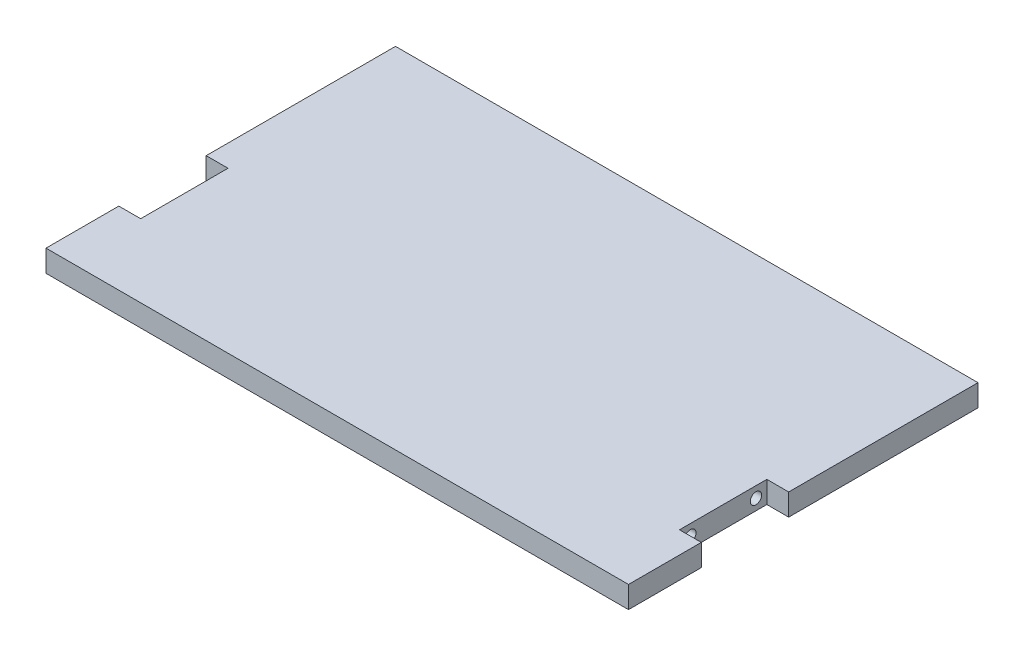
ISO-10303-21;
HEADER;
FILE_DESCRIPTION(('STEP AP214'),'2;1');
FILE_NAME('part.step','',(''),(''),'','','');
FILE_SCHEMA(('AUTOMOTIVE_DESIGN { 1 0 10303 214 1 1 1 1 }'));
ENDSEC;
DATA;
#1=APPLICATION_CONTEXT('core data for automotive mechanical design processes');
#2=APPLICATION_PROTOCOL_DEFINITION('international standard','automotive_design',2000,#1);
#3=PRODUCT_CONTEXT('',#1,'mechanical');
#4=PRODUCT('Part','Part','',(#3));
#5=PRODUCT_RELATED_PRODUCT_CATEGORY('part','',(#4));
#6=PRODUCT_DEFINITION_FORMATION('','',#4);
#7=PRODUCT_DEFINITION_CONTEXT('part definition',#1,'design');
#8=PRODUCT_DEFINITION('design','',#6,#7);
#9=PRODUCT_DEFINITION_SHAPE('','',#8);
#10=(LENGTH_UNIT() NAMED_UNIT(*) SI_UNIT(.MILLI.,.METRE.));
#11=(NAMED_UNIT(*) PLANE_ANGLE_UNIT() SI_UNIT($,.RADIAN.));
#12=(NAMED_UNIT(*) SI_UNIT($,.STERADIAN.) SOLID_ANGLE_UNIT());
#13=UNCERTAINTY_MEASURE_WITH_UNIT(LENGTH_MEASURE(1.E-05),#10,'distance_accuracy_value','');
#14=(GEOMETRIC_REPRESENTATION_CONTEXT(3) GLOBAL_UNCERTAINTY_ASSIGNED_CONTEXT((#13)) GLOBAL_UNIT_ASSIGNED_CONTEXT((#10,
#11,#12)) REPRESENTATION_CONTEXT('',''));
#15=CARTESIAN_POINT('',(0.,0.,0.));
#16=DIRECTION('',(0.,0.,1.));
#17=DIRECTION('',(1.,0.,0.));
#18=AXIS2_PLACEMENT_3D('',#15,#16,#17);
#19=CARTESIAN_POINT('',(127.,9.525,-127.));
#20=DIRECTION('',(-1.,0.,0.));
#21=DIRECTION('',(0.,0.,1.));
#22=AXIS2_PLACEMENT_3D('',#19,#20,#21);
#23=PLANE('',#22);
#24=DIRECTION('',(0.,0.,-1.));
#25=VECTOR('',#24,1.);
#26=CARTESIAN_POINT('',(127.,9.525,-127.));
#27=LINE('',#26,#25);
#28=CARTESIAN_POINT('',(127.,9.525,-44.45));
#29=VERTEX_POINT('',#28);
#30=CARTESIAN_POINT('',(127.,9.525,-127.));
#31=VERTEX_POINT('',#30);
#32=EDGE_CURVE('E163',#29,#31,#27,.T.);
#33=ORIENTED_EDGE('',*,*,#32,.F.);
#34=DIRECTION('',(0.,1.,0.));
#35=VECTOR('',#34,1.);
#36=CARTESIAN_POINT('',(127.,0.,-44.45));
#37=LINE('',#36,#35);
#38=CARTESIAN_POINT('',(127.,0.,-44.45));
#39=VERTEX_POINT('',#38);
#40=EDGE_CURVE('E198',#39,#29,#37,.T.);
#41=ORIENTED_EDGE('',*,*,#40,.F.);
#42=DIRECTION('',(0.,0.,-1.));
#43=VECTOR('',#42,1.);
#44=CARTESIAN_POINT('',(127.,0.,-127.));
#45=LINE('',#44,#43);
#46=CARTESIAN_POINT('',(127.,0.,-127.));
#47=VERTEX_POINT('',#46);
#48=EDGE_CURVE('E152',#39,#47,#45,.T.);
#49=ORIENTED_EDGE('',*,*,#48,.T.);
#50=DIRECTION('',(0.,-1.,0.));
#51=VECTOR('',#50,1.);
#52=CARTESIAN_POINT('',(127.,9.525,-127.));
#53=LINE('',#52,#51);
#54=EDGE_CURVE('E11',#31,#47,#53,.T.);
#55=ORIENTED_EDGE('',*,*,#54,.F.);
#56=EDGE_LOOP('',(#33,#41,#49,#55));
#57=FACE_BOUND('',#56,.T.);
#58=ADVANCED_FACE('F33',(#57),#23,.F.);
#59=CARTESIAN_POINT('',(-127.,9.525,-127.));
#60=DIRECTION('',(1.,0.,0.));
#61=DIRECTION('',(0.,0.,-1.));
#62=AXIS2_PLACEMENT_3D('',#59,#60,#61);
#63=PLANE('',#62);
#64=DIRECTION('',(0.,0.,1.));
#65=VECTOR('',#64,1.);
#66=CARTESIAN_POINT('',(-127.,0.,-127.));
#67=LINE('',#66,#65);
#68=CARTESIAN_POINT('',(-127.,0.,-127.));
#69=VERTEX_POINT('',#68);
#70=CARTESIAN_POINT('',(-127.,0.,-44.45));
#71=VERTEX_POINT('',#70);
#72=EDGE_CURVE('E161',#69,#71,#67,.T.);
#73=ORIENTED_EDGE('',*,*,#72,.T.);
#74=DIRECTION('',(0.,1.,0.));
#75=VECTOR('',#74,1.);
#76=CARTESIAN_POINT('',(-127.,0.,-44.45));
#77=LINE('',#76,#75);
#78=CARTESIAN_POINT('',(-127.,9.525,-44.45));
#79=VERTEX_POINT('',#78);
#80=EDGE_CURVE('E156',#71,#79,#77,.T.);
#81=ORIENTED_EDGE('',*,*,#80,.T.);
#82=DIRECTION('',(0.,0.,1.));
#83=VECTOR('',#82,1.);
#84=CARTESIAN_POINT('',(-127.,9.525,-127.));
#85=LINE('',#84,#83);
#86=CARTESIAN_POINT('',(-127.,9.525,-127.));
#87=VERTEX_POINT('',#86);
#88=EDGE_CURVE('E158',#87,#79,#85,.T.);
#89=ORIENTED_EDGE('',*,*,#88,.F.);
#90=DIRECTION('',(0.,-1.,0.));
#91=VECTOR('',#90,1.);
#92=CARTESIAN_POINT('',(-127.,9.525,-127.));
#93=LINE('',#92,#91);
#94=EDGE_CURVE('E41',#87,#69,#93,.T.);
#95=ORIENTED_EDGE('',*,*,#94,.T.);
#96=EDGE_LOOP('',(#73,#81,#89,#95));
#97=FACE_BOUND('',#96,.T.);
#98=ADVANCED_FACE('F266',(#97),#63,.F.);
#99=CARTESIAN_POINT('',(127.,9.525,25.4));
#100=VERTEX_POINT('',#99);
#101=CARTESIAN_POINT('',(127.,9.525,-6.34999999999999));
#102=VERTEX_POINT('',#101);
#103=EDGE_CURVE('E147',#100,#102,#27,.T.);
#104=ORIENTED_EDGE('',*,*,#103,.F.);
#105=DIRECTION('',(0.,1.,0.));
#106=VECTOR('',#105,1.);
#107=CARTESIAN_POINT('',(127.,0.,25.4));
#108=LINE('',#107,#106);
#109=CARTESIAN_POINT('',(127.,0.,25.4));
#110=VERTEX_POINT('',#109);
#111=EDGE_CURVE('E135',#110,#100,#108,.T.);
#112=ORIENTED_EDGE('',*,*,#111,.F.);
#113=CARTESIAN_POINT('',(127.,0.,-6.34999999999999));
#114=VERTEX_POINT('',#113);
#115=EDGE_CURVE('E146',#110,#114,#45,.T.);
#116=ORIENTED_EDGE('',*,*,#115,.T.);
#117=DIRECTION('',(0.,1.,0.));
#118=VECTOR('',#117,1.);
#119=CARTESIAN_POINT('',(127.,0.,-6.34999999999999));
#120=LINE('',#119,#118);
#121=EDGE_CURVE('E210',#114,#102,#120,.T.);
#122=ORIENTED_EDGE('',*,*,#121,.T.);
#123=EDGE_LOOP('',(#104,#112,#116,#122));
#124=FACE_BOUND('',#123,.T.);
#125=ADVANCED_FACE('F35',(#124),#23,.F.);
#126=CARTESIAN_POINT('',(-127.,9.525,-127.));
#127=DIRECTION('',(0.,0.,1.));
#128=DIRECTION('',(1.,0.,0.));
#129=AXIS2_PLACEMENT_3D('',#126,#127,#128);
#130=PLANE('',#129);
#131=DIRECTION('',(-1.,0.,0.));
#132=VECTOR('',#131,1.);
#133=CARTESIAN_POINT('',(-127.,0.,-127.));
#134=LINE('',#133,#132);
#135=EDGE_CURVE('E151',#47,#69,#134,.T.);
#136=ORIENTED_EDGE('',*,*,#135,.T.);
#137=ORIENTED_EDGE('',*,*,#94,.F.);
#138=DIRECTION('',(-1.,0.,0.));
#139=VECTOR('',#138,1.);
#140=CARTESIAN_POINT('',(-127.,9.525,-127.));
#141=LINE('',#140,#139);
#142=EDGE_CURVE('E174',#31,#87,#141,.T.);
#143=ORIENTED_EDGE('',*,*,#142,.F.);
#144=ORIENTED_EDGE('',*,*,#54,.T.);
#145=EDGE_LOOP('',(#136,#137,#143,#144));
#146=FACE_BOUND('',#145,.T.);
#147=ADVANCED_FACE('F273',(#146),#130,.F.);
#148=CARTESIAN_POINT('',(-127.,0.,-6.34999999999999));
#149=VERTEX_POINT('',#148);
#150=CARTESIAN_POINT('',(-127.,0.,25.4));
#151=VERTEX_POINT('',#150);
#152=EDGE_CURVE('E154',#149,#151,#67,.T.);
#153=ORIENTED_EDGE('',*,*,#152,.T.);
#154=DIRECTION('',(0.,1.,0.));
#155=VECTOR('',#154,1.);
#156=CARTESIAN_POINT('',(-127.,0.,25.4));
#157=LINE('',#156,#155);
#158=CARTESIAN_POINT('',(-127.,9.525,25.4));
#159=VERTEX_POINT('',#158);
#160=EDGE_CURVE('E48',#151,#159,#157,.T.);
#161=ORIENTED_EDGE('',*,*,#160,.T.);
#162=CARTESIAN_POINT('',(-127.,9.525,-6.34999999999999));
#163=VERTEX_POINT('',#162);
#164=EDGE_CURVE('E170',#163,#159,#85,.T.);
#165=ORIENTED_EDGE('',*,*,#164,.F.);
#166=DIRECTION('',(0.,1.,0.));
#167=VECTOR('',#166,1.);
#168=CARTESIAN_POINT('',(-127.,0.,-6.34999999999999));
#169=LINE('',#168,#167);
#170=EDGE_CURVE('E180',#149,#163,#169,.T.);
#171=ORIENTED_EDGE('',*,*,#170,.F.);
#172=EDGE_LOOP('',(#153,#161,#165,#171));
#173=FACE_BOUND('',#172,.T.);
#174=ADVANCED_FACE('F254',(#173),#63,.F.);
#175=CARTESIAN_POINT('',(0.,9.525,0.));
#176=DIRECTION('',(0.,1.,0.));
#177=DIRECTION('',(0.,0.,1.));
#178=AXIS2_PLACEMENT_3D('',#175,#176,#177);
#179=PLANE('',#178);
#180=DIRECTION('',(-1.,0.,0.));
#181=VECTOR('',#180,1.);
#182=CARTESIAN_POINT('',(-127.,9.525,25.4));
#183=LINE('',#182,#181);
#184=EDGE_CURVE('E141',#100,#159,#183,.T.);
#185=ORIENTED_EDGE('',*,*,#184,.F.);
#186=ORIENTED_EDGE('',*,*,#103,.T.);
#187=DIRECTION('',(1.,0.,0.));
#188=VECTOR('',#187,1.);
#189=CARTESIAN_POINT('',(127.,9.525,-6.34999999999999));
#190=LINE('',#189,#188);
#191=CARTESIAN_POINT('',(117.475,9.525,-6.34999999999999));
#192=VERTEX_POINT('',#191);
#193=EDGE_CURVE('E213',#192,#102,#190,.T.);
#194=ORIENTED_EDGE('',*,*,#193,.F.);
#195=DIRECTION('',(0.,0.,1.));
#196=VECTOR('',#195,1.);
#197=CARTESIAN_POINT('',(117.475,9.525,-44.45));
#198=LINE('',#197,#196);
#199=CARTESIAN_POINT('',(117.475,9.525,-44.45));
#200=VERTEX_POINT('',#199);
#201=EDGE_CURVE('E217',#200,#192,#198,.T.);
#202=ORIENTED_EDGE('',*,*,#201,.F.);
#203=DIRECTION('',(-1.,0.,0.));
#204=VECTOR('',#203,1.);
#205=CARTESIAN_POINT('',(127.,9.525,-44.45));
#206=LINE('',#205,#204);
#207=EDGE_CURVE('E220',#29,#200,#206,.T.);
#208=ORIENTED_EDGE('',*,*,#207,.F.);
#209=ORIENTED_EDGE('',*,*,#32,.T.);
#210=ORIENTED_EDGE('',*,*,#142,.T.);
#211=ORIENTED_EDGE('',*,*,#88,.T.);
#212=DIRECTION('',(-1.,0.,0.));
#213=VECTOR('',#212,1.);
#214=CARTESIAN_POINT('',(-127.,9.525,-44.45));
#215=LINE('',#214,#213);
#216=CARTESIAN_POINT('',(-117.475,9.525,-44.45));
#217=VERTEX_POINT('',#216);
#218=EDGE_CURVE('E189',#217,#79,#215,.T.);
#219=ORIENTED_EDGE('',*,*,#218,.F.);
#220=DIRECTION('',(0.,0.,-1.));
#221=VECTOR('',#220,1.);
#222=CARTESIAN_POINT('',(-117.475,9.525,-44.45));
#223=LINE('',#222,#221);
#224=CARTESIAN_POINT('',(-117.475,9.525,-6.34999999999999));
#225=VERTEX_POINT('',#224);
#226=EDGE_CURVE('E192',#225,#217,#223,.T.);
#227=ORIENTED_EDGE('',*,*,#226,.F.);
#228=DIRECTION('',(1.,0.,0.));
#229=VECTOR('',#228,1.);
#230=CARTESIAN_POINT('',(-127.,9.525,-6.34999999999999));
#231=LINE('',#230,#229);
#232=EDGE_CURVE('E195',#163,#225,#231,.T.);
#233=ORIENTED_EDGE('',*,*,#232,.F.);
#234=ORIENTED_EDGE('',*,*,#164,.T.);
#235=EDGE_LOOP('',(#185,#186,#194,#202,#208,#209,#210,#211,#219,#227,#233,#234));
#236=FACE_BOUND('',#235,.T.);
#237=ADVANCED_FACE('F277',(#236),#179,.T.);
#238=CARTESIAN_POINT('',(0.,0.,0.));
#239=DIRECTION('',(0.,1.,0.));
#240=DIRECTION('',(0.,0.,1.));
#241=AXIS2_PLACEMENT_3D('',#238,#239,#240);
#242=PLANE('',#241);
#243=ORIENTED_EDGE('',*,*,#115,.F.);
#244=DIRECTION('',(-1.,0.,0.));
#245=VECTOR('',#244,1.);
#246=CARTESIAN_POINT('',(-127.,0.,25.4));
#247=LINE('',#246,#245);
#248=EDGE_CURVE('E132',#110,#151,#247,.T.);
#249=ORIENTED_EDGE('',*,*,#248,.T.);
#250=ORIENTED_EDGE('',*,*,#152,.F.);
#251=DIRECTION('',(1.,0.,0.));
#252=VECTOR('',#251,1.);
#253=CARTESIAN_POINT('',(-127.,0.,-6.34999999999999));
#254=LINE('',#253,#252);
#255=CARTESIAN_POINT('',(-117.475,0.,-6.34999999999999));
#256=VERTEX_POINT('',#255);
#257=EDGE_CURVE('E191',#149,#256,#254,.T.);
#258=ORIENTED_EDGE('',*,*,#257,.T.);
#259=DIRECTION('',(0.,0.,-1.));
#260=VECTOR('',#259,1.);
#261=CARTESIAN_POINT('',(-117.475,0.,-44.45));
#262=LINE('',#261,#260);
#263=CARTESIAN_POINT('',(-117.475,0.,-44.45));
#264=VERTEX_POINT('',#263);
#265=EDGE_CURVE('E201',#256,#264,#262,.T.);
#266=ORIENTED_EDGE('',*,*,#265,.T.);
#267=DIRECTION('',(-1.,0.,0.));
#268=VECTOR('',#267,1.);
#269=CARTESIAN_POINT('',(-127.,0.,-44.45));
#270=LINE('',#269,#268);
#271=EDGE_CURVE('E183',#264,#71,#270,.T.);
#272=ORIENTED_EDGE('',*,*,#271,.T.);
#273=ORIENTED_EDGE('',*,*,#72,.F.);
#274=ORIENTED_EDGE('',*,*,#135,.F.);
#275=ORIENTED_EDGE('',*,*,#48,.F.);
#276=DIRECTION('',(-1.,0.,0.));
#277=VECTOR('',#276,1.);
#278=CARTESIAN_POINT('',(127.,0.,-44.45));
#279=LINE('',#278,#277);
#280=CARTESIAN_POINT('',(117.475,0.,-44.45));
#281=VERTEX_POINT('',#280);
#282=EDGE_CURVE('E216',#39,#281,#279,.T.);
#283=ORIENTED_EDGE('',*,*,#282,.T.);
#284=DIRECTION('',(0.,0.,1.));
#285=VECTOR('',#284,1.);
#286=CARTESIAN_POINT('',(117.475,0.,-44.45));
#287=LINE('',#286,#285);
#288=CARTESIAN_POINT('',(117.475,0.,-6.34999999999999));
#289=VERTEX_POINT('',#288);
#290=EDGE_CURVE('E225',#281,#289,#287,.T.);
#291=ORIENTED_EDGE('',*,*,#290,.T.);
#292=DIRECTION('',(1.,0.,0.));
#293=VECTOR('',#292,1.);
#294=CARTESIAN_POINT('',(127.,0.,-6.34999999999999));
#295=LINE('',#294,#293);
#296=EDGE_CURVE('E56',#289,#114,#295,.T.);
#297=ORIENTED_EDGE('',*,*,#296,.T.);
#298=EDGE_LOOP('',(#243,#249,#250,#258,#266,#272,#273,#274,#275,#283,#291,#297));
#299=FACE_BOUND('',#298,.T.);
#300=ADVANCED_FACE('F149',(#299),#242,.F.);
#301=CARTESIAN_POINT('',(-127.,0.,-44.45));
#302=DIRECTION('',(0.,0.,-1.));
#303=DIRECTION('',(-1.,0.,0.));
#304=AXIS2_PLACEMENT_3D('',#301,#302,#303);
#305=PLANE('',#304);
#306=ORIENTED_EDGE('',*,*,#218,.T.);
#307=ORIENTED_EDGE('',*,*,#80,.F.);
#308=ORIENTED_EDGE('',*,*,#271,.F.);
#309=DIRECTION('',(0.,1.,0.));
#310=VECTOR('',#309,1.);
#311=CARTESIAN_POINT('',(-117.475,0.,-44.45));
#312=LINE('',#311,#310);
#313=EDGE_CURVE('E185',#264,#217,#312,.T.);
#314=ORIENTED_EDGE('',*,*,#313,.T.);
#315=EDGE_LOOP('',(#306,#307,#308,#314));
#316=FACE_BOUND('',#315,.T.);
#317=ADVANCED_FACE('F264',(#316),#305,.F.);
#318=CARTESIAN_POINT('',(-117.475,0.,-44.45));
#319=DIRECTION('',(1.,0.,0.));
#320=DIRECTION('',(0.,0.,-1.));
#321=AXIS2_PLACEMENT_3D('',#318,#319,#320);
#322=PLANE('',#321);
#323=CARTESIAN_POINT('',(-117.475,4.7625,-39.6875));
#324=DIRECTION('',(-1.,0.,0.));
#325=DIRECTION('',(0.,0.,1.));
#326=AXIS2_PLACEMENT_3D('',#323,#324,#325);
#327=CIRCLE('',#326,2.45744999999999);
#328=CARTESIAN_POINT('',(-117.475,4.7625,-37.23005));
#329=VERTEX_POINT('',#328);
#330=EDGE_CURVE('E249',#329,#329,#327,.T.);
#331=ORIENTED_EDGE('',*,*,#330,.F.);
#332=EDGE_LOOP('',(#331));
#333=FACE_BOUND('',#332,.T.);
#334=CARTESIAN_POINT('',(-117.475,4.7625,-11.1125));
#335=DIRECTION('',(-1.,0.,0.));
#336=DIRECTION('',(0.,0.,1.));
#337=AXIS2_PLACEMENT_3D('',#334,#335,#336);
#338=CIRCLE('',#337,2.45744999999999);
#339=CARTESIAN_POINT('',(-117.475,4.7625,-8.65505));
#340=VERTEX_POINT('',#339);
#341=EDGE_CURVE('E243',#340,#340,#338,.T.);
#342=ORIENTED_EDGE('',*,*,#341,.F.);
#343=EDGE_LOOP('',(#342));
#344=FACE_BOUND('',#343,.T.);
#345=ORIENTED_EDGE('',*,*,#226,.T.);
#346=ORIENTED_EDGE('',*,*,#313,.F.);
#347=ORIENTED_EDGE('',*,*,#265,.F.);
#348=DIRECTION('',(0.,1.,0.));
#349=VECTOR('',#348,1.);
#350=CARTESIAN_POINT('',(-117.475,0.,-6.34999999999999));
#351=LINE('',#350,#349);
#352=EDGE_CURVE('E182',#256,#225,#351,.T.);
#353=ORIENTED_EDGE('',*,*,#352,.T.);
#354=EDGE_LOOP('',(#345,#346,#347,#353));
#355=FACE_BOUND('',#354,.T.);
#356=ADVANCED_FACE('F261',(#333,#344,#355),#322,.F.);
#357=CARTESIAN_POINT('',(-127.,0.,-6.34999999999999));
#358=DIRECTION('',(0.,0.,1.));
#359=DIRECTION('',(1.,0.,0.));
#360=AXIS2_PLACEMENT_3D('',#357,#358,#359);
#361=PLANE('',#360);
#362=ORIENTED_EDGE('',*,*,#232,.T.);
#363=ORIENTED_EDGE('',*,*,#352,.F.);
#364=ORIENTED_EDGE('',*,*,#257,.F.);
#365=ORIENTED_EDGE('',*,*,#170,.T.);
#366=EDGE_LOOP('',(#362,#363,#364,#365));
#367=FACE_BOUND('',#366,.T.);
#368=ADVANCED_FACE('F258',(#367),#361,.F.);
#369=CARTESIAN_POINT('',(127.,0.,-44.45));
#370=DIRECTION('',(0.,0.,-1.));
#371=DIRECTION('',(-1.,0.,0.));
#372=AXIS2_PLACEMENT_3D('',#369,#370,#371);
#373=PLANE('',#372);
#374=ORIENTED_EDGE('',*,*,#207,.T.);
#375=DIRECTION('',(0.,1.,0.));
#376=VECTOR('',#375,1.);
#377=CARTESIAN_POINT('',(117.475,0.,-44.45));
#378=LINE('',#377,#376);
#379=EDGE_CURVE('E206',#281,#200,#378,.T.);
#380=ORIENTED_EDGE('',*,*,#379,.F.);
#381=ORIENTED_EDGE('',*,*,#282,.F.);
#382=ORIENTED_EDGE('',*,*,#40,.T.);
#383=EDGE_LOOP('',(#374,#380,#381,#382));
#384=FACE_BOUND('',#383,.T.);
#385=ADVANCED_FACE('F292',(#384),#373,.F.);
#386=CARTESIAN_POINT('',(127.,0.,-6.34999999999999));
#387=DIRECTION('',(0.,0.,1.));
#388=DIRECTION('',(1.,0.,0.));
#389=AXIS2_PLACEMENT_3D('',#386,#387,#388);
#390=PLANE('',#389);
#391=ORIENTED_EDGE('',*,*,#193,.T.);
#392=ORIENTED_EDGE('',*,*,#121,.F.);
#393=ORIENTED_EDGE('',*,*,#296,.F.);
#394=DIRECTION('',(0.,1.,0.));
#395=VECTOR('',#394,1.);
#396=CARTESIAN_POINT('',(117.475,0.,-6.34999999999999));
#397=LINE('',#396,#395);
#398=EDGE_CURVE('E208',#289,#192,#397,.T.);
#399=ORIENTED_EDGE('',*,*,#398,.T.);
#400=EDGE_LOOP('',(#391,#392,#393,#399));
#401=FACE_BOUND('',#400,.T.);
#402=ADVANCED_FACE('F298',(#401),#390,.F.);
#403=CARTESIAN_POINT('',(117.475,0.,-44.45));
#404=DIRECTION('',(-1.,0.,0.));
#405=DIRECTION('',(0.,0.,1.));
#406=AXIS2_PLACEMENT_3D('',#403,#404,#405);
#407=PLANE('',#406);
#408=CARTESIAN_POINT('',(117.475,4.7625,-11.1125));
#409=DIRECTION('',(1.,0.,0.));
#410=DIRECTION('',(0.,0.,-1.));
#411=AXIS2_PLACEMENT_3D('',#408,#409,#410);
#412=CIRCLE('',#411,2.45744999999999);
#413=CARTESIAN_POINT('',(117.475,4.7625,-13.56995));
#414=VERTEX_POINT('',#413);
#415=EDGE_CURVE('E237',#414,#414,#412,.T.);
#416=ORIENTED_EDGE('',*,*,#415,.F.);
#417=EDGE_LOOP('',(#416));
#418=FACE_BOUND('',#417,.T.);
#419=CARTESIAN_POINT('',(117.475,4.7625,-39.6875));
#420=DIRECTION('',(1.,0.,0.));
#421=DIRECTION('',(0.,0.,-1.));
#422=AXIS2_PLACEMENT_3D('',#419,#420,#421);
#423=CIRCLE('',#422,2.45744999999999);
#424=CARTESIAN_POINT('',(117.475,4.7625,-42.14495));
#425=VERTEX_POINT('',#424);
#426=EDGE_CURVE('E231',#425,#425,#423,.T.);
#427=ORIENTED_EDGE('',*,*,#426,.F.);
#428=EDGE_LOOP('',(#427));
#429=FACE_BOUND('',#428,.T.);
#430=ORIENTED_EDGE('',*,*,#201,.T.);
#431=ORIENTED_EDGE('',*,*,#398,.F.);
#432=ORIENTED_EDGE('',*,*,#290,.F.);
#433=ORIENTED_EDGE('',*,*,#379,.T.);
#434=EDGE_LOOP('',(#430,#431,#432,#433));
#435=FACE_BOUND('',#434,.T.);
#436=ADVANCED_FACE('F296',(#418,#429,#435),#407,.F.);
#437=CARTESIAN_POINT('',(104.775,4.7625,-39.6875));
#438=DIRECTION('',(1.,0.,0.));
#439=DIRECTION('',(0.,0.,-1.));
#440=AXIS2_PLACEMENT_3D('',#437,#438,#439);
#441=CONICAL_SURFACE('',#440,2.45745,1.02974425867665);
#442=CARTESIAN_POINT('',(103.298415071771,4.76249999999999,-39.6875));
#443=VERTEX_POINT('',#442);
#444=VERTEX_LOOP('',#443);
#445=FACE_BOUND('',#444,.T.);
#446=CARTESIAN_POINT('',(104.775,4.7625,-39.6875));
#447=DIRECTION('',(1.,0.,0.));
#448=DIRECTION('',(0.,0.,-1.));
#449=AXIS2_PLACEMENT_3D('',#446,#447,#448);
#450=CIRCLE('',#449,2.45745);
#451=CARTESIAN_POINT('',(104.775,4.7625,-42.14495));
#452=VERTEX_POINT('',#451);
#453=EDGE_CURVE('E223',#452,#452,#450,.T.);
#454=ORIENTED_EDGE('',*,*,#453,.T.);
#455=EDGE_LOOP('',(#454));
#456=FACE_BOUND('',#455,.T.);
#457=ADVANCED_FACE('F305',(#445,#456),#441,.F.);
#458=CARTESIAN_POINT('',(117.475,4.7625,-39.6875));
#459=DIRECTION('',(1.,0.,0.));
#460=DIRECTION('',(0.,0.,-1.));
#461=AXIS2_PLACEMENT_3D('',#458,#459,#460);
#462=CYLINDRICAL_SURFACE('',#461,2.45744999999999);
#463=ORIENTED_EDGE('',*,*,#453,.F.);
#464=EDGE_LOOP('',(#463));
#465=FACE_BOUND('',#464,.T.);
#466=ORIENTED_EDGE('',*,*,#426,.T.);
#467=EDGE_LOOP('',(#466));
#468=FACE_BOUND('',#467,.T.);
#469=ADVANCED_FACE('F361',(#465,#468),#462,.F.);
#470=CARTESIAN_POINT('',(104.775,4.7625,-11.1125));
#471=DIRECTION('',(1.,0.,0.));
#472=DIRECTION('',(0.,0.,-1.));
#473=AXIS2_PLACEMENT_3D('',#470,#471,#472);
#474=CONICAL_SURFACE('',#473,2.45745,1.02974425867665);
#475=CARTESIAN_POINT('',(103.298415071771,4.7625,-11.1125));
#476=VERTEX_POINT('',#475);
#477=VERTEX_LOOP('',#476);
#478=FACE_BOUND('',#477,.T.);
#479=CARTESIAN_POINT('',(104.775,4.7625,-11.1125));
#480=DIRECTION('',(1.,0.,0.));
#481=DIRECTION('',(0.,0.,-1.));
#482=AXIS2_PLACEMENT_3D('',#479,#480,#481);
#483=CIRCLE('',#482,2.45745);
#484=CARTESIAN_POINT('',(104.775,4.7625,-13.56995));
#485=VERTEX_POINT('',#484);
#486=EDGE_CURVE('E234',#485,#485,#483,.T.);
#487=ORIENTED_EDGE('',*,*,#486,.T.);
#488=EDGE_LOOP('',(#487));
#489=FACE_BOUND('',#488,.T.);
#490=ADVANCED_FACE('F370',(#478,#489),#474,.F.);
#491=CARTESIAN_POINT('',(117.475,4.7625,-11.1125));
#492=DIRECTION('',(1.,0.,0.));
#493=DIRECTION('',(0.,0.,-1.));
#494=AXIS2_PLACEMENT_3D('',#491,#492,#493);
#495=CYLINDRICAL_SURFACE('',#494,2.45744999999999);
#496=ORIENTED_EDGE('',*,*,#486,.F.);
#497=EDGE_LOOP('',(#496));
#498=FACE_BOUND('',#497,.T.);
#499=ORIENTED_EDGE('',*,*,#415,.T.);
#500=EDGE_LOOP('',(#499));
#501=FACE_BOUND('',#500,.T.);
#502=ADVANCED_FACE('F378',(#498,#501),#495,.F.);
#503=CARTESIAN_POINT('',(-104.775,4.7625,-11.1125));
#504=DIRECTION('',(-1.,0.,0.));
#505=DIRECTION('',(0.,0.,1.));
#506=AXIS2_PLACEMENT_3D('',#503,#504,#505);
#507=CONICAL_SURFACE('',#506,2.45744999999999,1.02974425867665);
#508=CARTESIAN_POINT('',(-103.298415071771,4.7625,-11.1125));
#509=VERTEX_POINT('',#508);
#510=VERTEX_LOOP('',#509);
#511=FACE_BOUND('',#510,.T.);
#512=CARTESIAN_POINT('',(-104.775,4.7625,-11.1125));
#513=DIRECTION('',(-1.,0.,0.));
#514=DIRECTION('',(0.,0.,1.));
#515=AXIS2_PLACEMENT_3D('',#512,#513,#514);
#516=CIRCLE('',#515,2.45744999999999);
#517=CARTESIAN_POINT('',(-104.775,4.7625,-8.65505000000001));
#518=VERTEX_POINT('',#517);
#519=EDGE_CURVE('E240',#518,#518,#516,.T.);
#520=ORIENTED_EDGE('',*,*,#519,.T.);
#521=EDGE_LOOP('',(#520));
#522=FACE_BOUND('',#521,.T.);
#523=ADVANCED_FACE('F387',(#511,#522),#507,.F.);
#524=CARTESIAN_POINT('',(-117.475,4.7625,-11.1125));
#525=DIRECTION('',(-1.,0.,0.));
#526=DIRECTION('',(0.,0.,1.));
#527=AXIS2_PLACEMENT_3D('',#524,#525,#526);
#528=CYLINDRICAL_SURFACE('',#527,2.45744999999999);
#529=ORIENTED_EDGE('',*,*,#519,.F.);
#530=EDGE_LOOP('',(#529));
#531=FACE_BOUND('',#530,.T.);
#532=ORIENTED_EDGE('',*,*,#341,.T.);
#533=EDGE_LOOP('',(#532));
#534=FACE_BOUND('',#533,.T.);
#535=ADVANCED_FACE('F397',(#531,#534),#528,.F.);
#536=CARTESIAN_POINT('',(-104.775,4.7625,-39.6875));
#537=DIRECTION('',(-1.,0.,0.));
#538=DIRECTION('',(0.,0.,1.));
#539=AXIS2_PLACEMENT_3D('',#536,#537,#538);
#540=CONICAL_SURFACE('',#539,2.45744999999999,1.02974425867665);
#541=CARTESIAN_POINT('',(-103.298415071771,4.7625,-39.6875));
#542=VERTEX_POINT('',#541);
#543=VERTEX_LOOP('',#542);
#544=FACE_BOUND('',#543,.T.);
#545=CARTESIAN_POINT('',(-104.775,4.7625,-39.6875));
#546=DIRECTION('',(-1.,0.,0.));
#547=DIRECTION('',(0.,0.,1.));
#548=AXIS2_PLACEMENT_3D('',#545,#546,#547);
#549=CIRCLE('',#548,2.45744999999999);
#550=CARTESIAN_POINT('',(-104.775,4.7625,-37.23005));
#551=VERTEX_POINT('',#550);
#552=EDGE_CURVE('E246',#551,#551,#549,.T.);
#553=ORIENTED_EDGE('',*,*,#552,.T.);
#554=EDGE_LOOP('',(#553));
#555=FACE_BOUND('',#554,.T.);
#556=ADVANCED_FACE('F404',(#544,#555),#540,.F.);
#557=CARTESIAN_POINT('',(-117.475,4.7625,-39.6875));
#558=DIRECTION('',(-1.,0.,0.));
#559=DIRECTION('',(0.,0.,1.));
#560=AXIS2_PLACEMENT_3D('',#557,#558,#559);
#561=CYLINDRICAL_SURFACE('',#560,2.45744999999999);
#562=ORIENTED_EDGE('',*,*,#552,.F.);
#563=EDGE_LOOP('',(#562));
#564=FACE_BOUND('',#563,.T.);
#565=ORIENTED_EDGE('',*,*,#330,.T.);
#566=EDGE_LOOP('',(#565));
#567=FACE_BOUND('',#566,.T.);
#568=ADVANCED_FACE('F412',(#564,#567),#561,.F.);
#569=CARTESIAN_POINT('',(-127.,0.,25.4));
#570=DIRECTION('',(0.,0.,-1.));
#571=DIRECTION('',(-1.,0.,0.));
#572=AXIS2_PLACEMENT_3D('',#569,#570,#571);
#573=PLANE('',#572);
#574=ORIENTED_EDGE('',*,*,#184,.T.);
#575=ORIENTED_EDGE('',*,*,#160,.F.);
#576=ORIENTED_EDGE('',*,*,#248,.F.);
#577=ORIENTED_EDGE('',*,*,#111,.T.);
#578=EDGE_LOOP('',(#574,#575,#576,#577));
#579=FACE_BOUND('',#578,.T.);
#580=ADVANCED_FACE('F134',(#579),#573,.F.);
#581=CLOSED_SHELL('',(#58,#98,#125,#147,#174,#237,#300,#317,#356,#368,#385,#402,#436,#457,#469,
#490,#502,#523,#535,#556,#568,#580));
#582=MANIFOLD_SOLID_BREP('B2',#581);
#583=ADVANCED_BREP_SHAPE_REPRESENTATION('',(#18,#582),#14);
#584=SHAPE_DEFINITION_REPRESENTATION(#9,#583);
ENDSEC;
END-ISO-10303-21;
